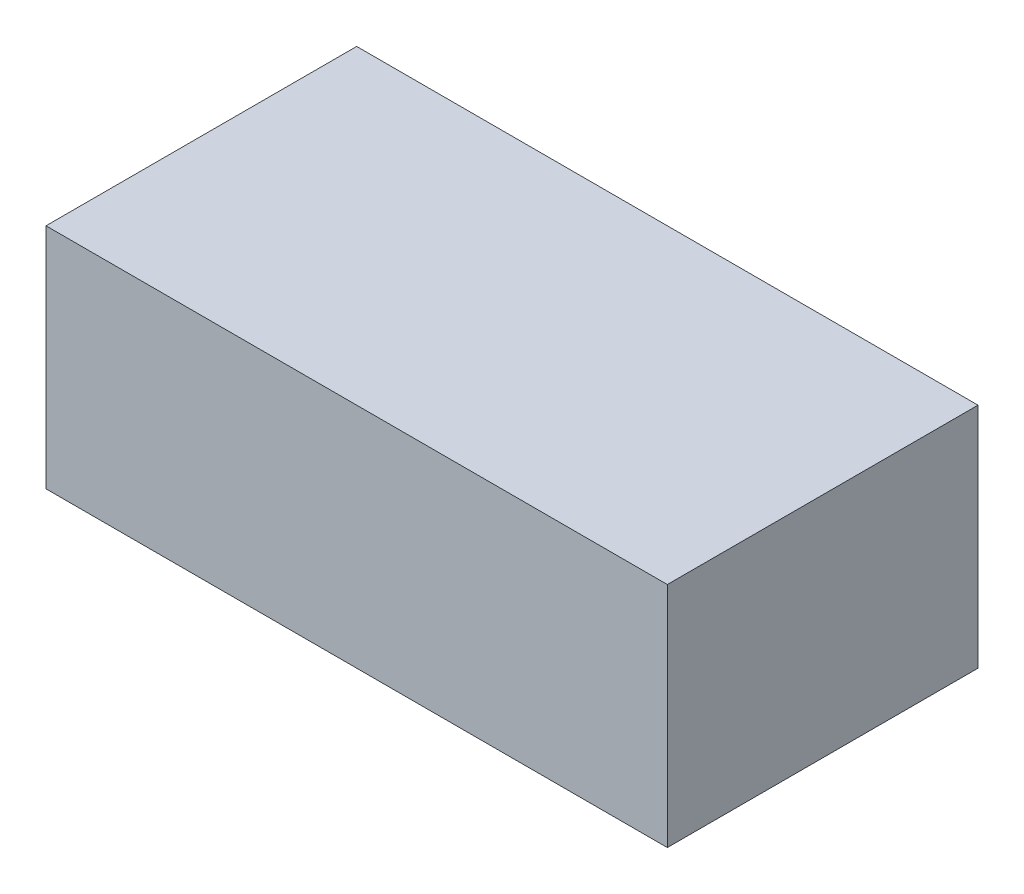
ISO-10303-21;
HEADER;
FILE_DESCRIPTION(('STEP AP214'),'2;1');
FILE_NAME('part.step','',(''),(''),'','','');
FILE_SCHEMA(('AUTOMOTIVE_DESIGN { 1 0 10303 214 1 1 1 1 }'));
ENDSEC;
DATA;
#1=APPLICATION_CONTEXT('core data for automotive mechanical design processes');
#2=APPLICATION_PROTOCOL_DEFINITION('international standard','automotive_design',2000,#1);
#3=PRODUCT_CONTEXT('',#1,'mechanical');
#4=PRODUCT('Part','Part','',(#3));
#5=PRODUCT_RELATED_PRODUCT_CATEGORY('part','',(#4));
#6=PRODUCT_DEFINITION_FORMATION('','',#4);
#7=PRODUCT_DEFINITION_CONTEXT('part definition',#1,'design');
#8=PRODUCT_DEFINITION('design','',#6,#7);
#9=PRODUCT_DEFINITION_SHAPE('','',#8);
#10=(LENGTH_UNIT() NAMED_UNIT(*) SI_UNIT(.MILLI.,.METRE.));
#11=(NAMED_UNIT(*) PLANE_ANGLE_UNIT() SI_UNIT($,.RADIAN.));
#12=(NAMED_UNIT(*) SI_UNIT($,.STERADIAN.) SOLID_ANGLE_UNIT());
#13=UNCERTAINTY_MEASURE_WITH_UNIT(LENGTH_MEASURE(1.E-05),#10,'distance_accuracy_value','');
#14=(GEOMETRIC_REPRESENTATION_CONTEXT(3) GLOBAL_UNCERTAINTY_ASSIGNED_CONTEXT((#13)) GLOBAL_UNIT_ASSIGNED_CONTEXT((#10,
#11,#12)) REPRESENTATION_CONTEXT('',''));
#15=CARTESIAN_POINT('',(0.,0.,0.));
#16=DIRECTION('',(0.,0.,1.));
#17=DIRECTION('',(1.,0.,0.));
#18=AXIS2_PLACEMENT_3D('',#15,#16,#17);
#19=CARTESIAN_POINT('',(-19.6485623003195,22.,-10.0159744408946));
#20=DIRECTION('',(1.,0.,0.));
#21=DIRECTION('',(0.,0.,-1.));
#22=AXIS2_PLACEMENT_3D('',#19,#20,#21);
#23=PLANE('',#22);
#24=DIRECTION('',(0.,0.,1.));
#25=VECTOR('',#24,1.);
#26=CARTESIAN_POINT('',(-19.6485623003195,0.,-10.0159744408946));
#27=LINE('',#26,#25);
#28=CARTESIAN_POINT('',(-19.6485623003195,0.,-10.0159744408946));
#29=VERTEX_POINT('',#28);
#30=CARTESIAN_POINT('',(-19.6485623003195,0.,19.9840255591054));
#31=VERTEX_POINT('',#30);
#32=EDGE_CURVE('E111',#29,#31,#27,.T.);
#33=ORIENTED_EDGE('',*,*,#32,.T.);
#34=DIRECTION('',(0.,-1.,0.));
#35=VECTOR('',#34,1.);
#36=CARTESIAN_POINT('',(-19.6485623003195,22.,19.9840255591054));
#37=LINE('',#36,#35);
#38=CARTESIAN_POINT('',(-19.6485623003195,22.,19.9840255591054));
#39=VERTEX_POINT('',#38);
#40=EDGE_CURVE('E11',#39,#31,#37,.T.);
#41=ORIENTED_EDGE('',*,*,#40,.F.);
#42=DIRECTION('',(0.,0.,1.));
#43=VECTOR('',#42,1.);
#44=CARTESIAN_POINT('',(-19.6485623003195,22.,-10.0159744408946));
#45=LINE('',#44,#43);
#46=CARTESIAN_POINT('',(-19.6485623003195,22.,-10.0159744408946));
#47=VERTEX_POINT('',#46);
#48=EDGE_CURVE('E95',#47,#39,#45,.T.);
#49=ORIENTED_EDGE('',*,*,#48,.F.);
#50=DIRECTION('',(0.,-1.,0.));
#51=VECTOR('',#50,1.);
#52=CARTESIAN_POINT('',(-19.6485623003195,22.,-10.0159744408946));
#53=LINE('',#52,#51);
#54=EDGE_CURVE('E107',#47,#29,#53,.T.);
#55=ORIENTED_EDGE('',*,*,#54,.T.);
#56=EDGE_LOOP('',(#33,#41,#49,#55));
#57=FACE_BOUND('',#56,.T.);
#58=ADVANCED_FACE('F43',(#57),#23,.F.);
#59=CARTESIAN_POINT('',(-19.6485623003195,22.,19.9840255591054));
#60=DIRECTION('',(0.,0.,-1.));
#61=DIRECTION('',(-1.,0.,0.));
#62=AXIS2_PLACEMENT_3D('',#59,#60,#61);
#63=PLANE('',#62);
#64=DIRECTION('',(1.,0.,0.));
#65=VECTOR('',#64,1.);
#66=CARTESIAN_POINT('',(-19.6485623003195,0.,19.9840255591054));
#67=LINE('',#66,#65);
#68=CARTESIAN_POINT('',(40.3514376996805,0.,19.9840255591054));
#69=VERTEX_POINT('',#68);
#70=EDGE_CURVE('E100',#31,#69,#67,.T.);
#71=ORIENTED_EDGE('',*,*,#70,.T.);
#72=DIRECTION('',(0.,-1.,0.));
#73=VECTOR('',#72,1.);
#74=CARTESIAN_POINT('',(40.3514376996805,22.,19.9840255591054));
#75=LINE('',#74,#73);
#76=CARTESIAN_POINT('',(40.3514376996805,22.,19.9840255591054));
#77=VERTEX_POINT('',#76);
#78=EDGE_CURVE('E52',#77,#69,#75,.T.);
#79=ORIENTED_EDGE('',*,*,#78,.F.);
#80=DIRECTION('',(1.,0.,0.));
#81=VECTOR('',#80,1.);
#82=CARTESIAN_POINT('',(-19.6485623003195,22.,19.9840255591054));
#83=LINE('',#82,#81);
#84=EDGE_CURVE('E90',#39,#77,#83,.T.);
#85=ORIENTED_EDGE('',*,*,#84,.F.);
#86=ORIENTED_EDGE('',*,*,#40,.T.);
#87=EDGE_LOOP('',(#71,#79,#85,#86));
#88=FACE_BOUND('',#87,.T.);
#89=ADVANCED_FACE('F99',(#88),#63,.F.);
#90=CARTESIAN_POINT('',(40.3514376996805,22.,-10.0159744408946));
#91=DIRECTION('',(-1.,0.,0.));
#92=DIRECTION('',(0.,0.,1.));
#93=AXIS2_PLACEMENT_3D('',#90,#91,#92);
#94=PLANE('',#93);
#95=DIRECTION('',(0.,0.,-1.));
#96=VECTOR('',#95,1.);
#97=CARTESIAN_POINT('',(40.3514376996805,0.,-10.0159744408946));
#98=LINE('',#97,#96);
#99=CARTESIAN_POINT('',(40.3514376996805,0.,-10.0159744408946));
#100=VERTEX_POINT('',#99);
#101=EDGE_CURVE('E77',#69,#100,#98,.T.);
#102=ORIENTED_EDGE('',*,*,#101,.T.);
#103=DIRECTION('',(0.,-1.,0.));
#104=VECTOR('',#103,1.);
#105=CARTESIAN_POINT('',(40.3514376996805,22.,-10.0159744408946));
#106=LINE('',#105,#104);
#107=CARTESIAN_POINT('',(40.3514376996805,22.,-10.0159744408946));
#108=VERTEX_POINT('',#107);
#109=EDGE_CURVE('E102',#108,#100,#106,.T.);
#110=ORIENTED_EDGE('',*,*,#109,.F.);
#111=DIRECTION('',(0.,0.,-1.));
#112=VECTOR('',#111,1.);
#113=CARTESIAN_POINT('',(40.3514376996805,22.,-10.0159744408946));
#114=LINE('',#113,#112);
#115=EDGE_CURVE('E93',#77,#108,#114,.T.);
#116=ORIENTED_EDGE('',*,*,#115,.F.);
#117=ORIENTED_EDGE('',*,*,#78,.T.);
#118=EDGE_LOOP('',(#102,#110,#116,#117));
#119=FACE_BOUND('',#118,.T.);
#120=ADVANCED_FACE('F103',(#119),#94,.F.);
#121=CARTESIAN_POINT('',(-19.6485623003195,22.,-10.0159744408946));
#122=DIRECTION('',(0.,0.,1.));
#123=DIRECTION('',(1.,0.,0.));
#124=AXIS2_PLACEMENT_3D('',#121,#122,#123);
#125=PLANE('',#124);
#126=DIRECTION('',(-1.,0.,0.));
#127=VECTOR('',#126,1.);
#128=CARTESIAN_POINT('',(-19.6485623003195,0.,-10.0159744408946));
#129=LINE('',#128,#127);
#130=EDGE_CURVE('E83',#100,#29,#129,.T.);
#131=ORIENTED_EDGE('',*,*,#130,.T.);
#132=ORIENTED_EDGE('',*,*,#54,.F.);
#133=DIRECTION('',(-1.,0.,0.));
#134=VECTOR('',#133,1.);
#135=CARTESIAN_POINT('',(-19.6485623003195,22.,-10.0159744408946));
#136=LINE('',#135,#134);
#137=EDGE_CURVE('E60',#108,#47,#136,.T.);
#138=ORIENTED_EDGE('',*,*,#137,.F.);
#139=ORIENTED_EDGE('',*,*,#109,.T.);
#140=EDGE_LOOP('',(#131,#132,#138,#139));
#141=FACE_BOUND('',#140,.T.);
#142=ADVANCED_FACE('F124',(#141),#125,.F.);
#143=CARTESIAN_POINT('',(0.,22.,0.));
#144=DIRECTION('',(0.,1.,0.));
#145=DIRECTION('',(0.,0.,1.));
#146=AXIS2_PLACEMENT_3D('',#143,#144,#145);
#147=PLANE('',#146);
#148=ORIENTED_EDGE('',*,*,#48,.T.);
#149=ORIENTED_EDGE('',*,*,#84,.T.);
#150=ORIENTED_EDGE('',*,*,#115,.T.);
#151=ORIENTED_EDGE('',*,*,#137,.T.);
#152=EDGE_LOOP('',(#148,#149,#150,#151));
#153=FACE_BOUND('',#152,.T.);
#154=ADVANCED_FACE('F91',(#153),#147,.T.);
#155=CARTESIAN_POINT('',(0.,0.,0.));
#156=DIRECTION('',(0.,1.,0.));
#157=DIRECTION('',(0.,0.,1.));
#158=AXIS2_PLACEMENT_3D('',#155,#156,#157);
#159=PLANE('',#158);
#160=ORIENTED_EDGE('',*,*,#32,.F.);
#161=ORIENTED_EDGE('',*,*,#130,.F.);
#162=ORIENTED_EDGE('',*,*,#101,.F.);
#163=ORIENTED_EDGE('',*,*,#70,.F.);
#164=EDGE_LOOP('',(#160,#161,#162,#163));
#165=FACE_BOUND('',#164,.T.);
#166=ADVANCED_FACE('F127',(#165),#159,.F.);
#167=CLOSED_SHELL('',(#58,#89,#120,#142,#154,#166));
#168=MANIFOLD_SOLID_BREP('B2',#167);
#169=ADVANCED_BREP_SHAPE_REPRESENTATION('',(#18,#168),#14);
#170=SHAPE_DEFINITION_REPRESENTATION(#9,#169);
ENDSEC;
END-ISO-10303-21;
